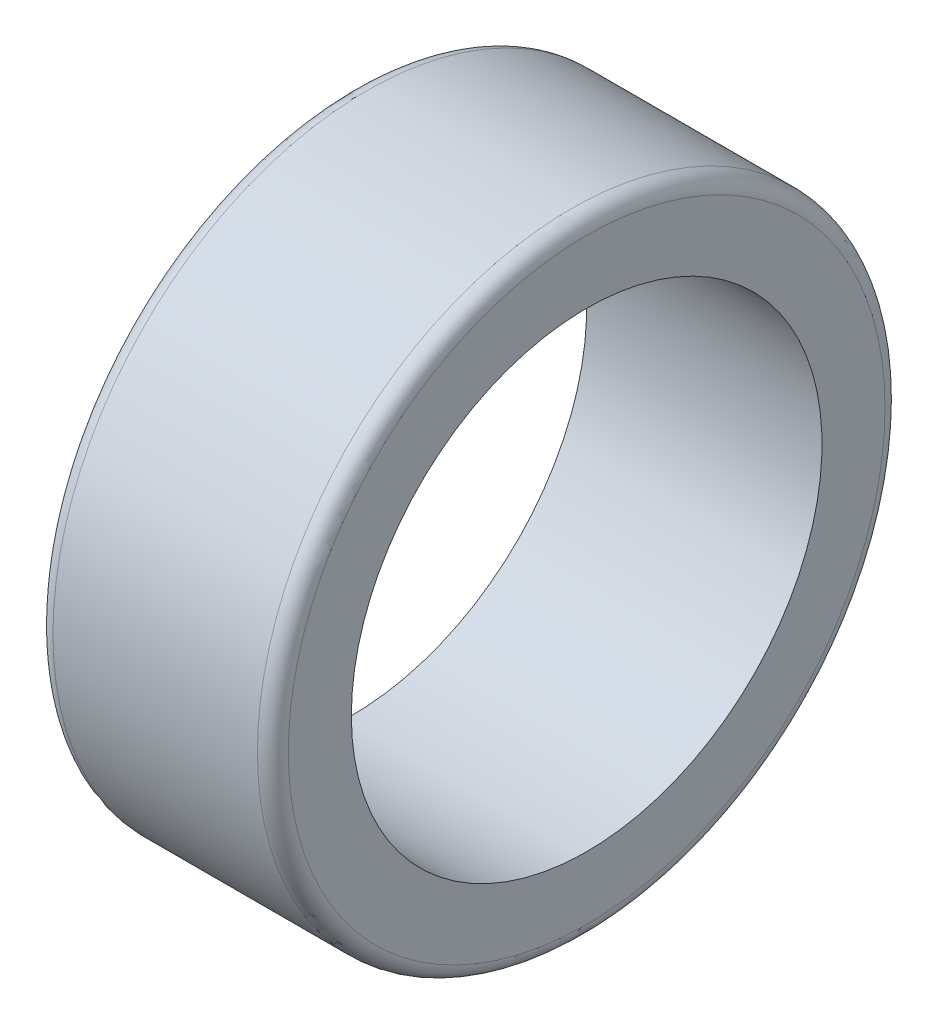
ISO-10303-21;
HEADER;
FILE_DESCRIPTION(('STEP AP214'),'2;1');
FILE_NAME('part.step','',(''),(''),'','','');
FILE_SCHEMA(('AUTOMOTIVE_DESIGN { 1 0 10303 214 1 1 1 1 }'));
ENDSEC;
DATA;
#1=APPLICATION_CONTEXT('core data for automotive mechanical design processes');
#2=APPLICATION_PROTOCOL_DEFINITION('international standard','automotive_design',2000,#1);
#3=PRODUCT_CONTEXT('',#1,'mechanical');
#4=PRODUCT('Part','Part','',(#3));
#5=PRODUCT_RELATED_PRODUCT_CATEGORY('part','',(#4));
#6=PRODUCT_DEFINITION_FORMATION('','',#4);
#7=PRODUCT_DEFINITION_CONTEXT('part definition',#1,'design');
#8=PRODUCT_DEFINITION('design','',#6,#7);
#9=PRODUCT_DEFINITION_SHAPE('','',#8);
#10=(LENGTH_UNIT() NAMED_UNIT(*) SI_UNIT(.MILLI.,.METRE.));
#11=(NAMED_UNIT(*) PLANE_ANGLE_UNIT() SI_UNIT($,.RADIAN.));
#12=(NAMED_UNIT(*) SI_UNIT($,.STERADIAN.) SOLID_ANGLE_UNIT());
#13=UNCERTAINTY_MEASURE_WITH_UNIT(LENGTH_MEASURE(1.E-05),#10,'distance_accuracy_value','');
#14=(GEOMETRIC_REPRESENTATION_CONTEXT(3) GLOBAL_UNCERTAINTY_ASSIGNED_CONTEXT((#13)) GLOBAL_UNIT_ASSIGNED_CONTEXT((#10,
#11,#12)) REPRESENTATION_CONTEXT('',''));
#15=CARTESIAN_POINT('',(0.,0.,0.));
#16=DIRECTION('',(0.,0.,1.));
#17=DIRECTION('',(1.,0.,0.));
#18=AXIS2_PLACEMENT_3D('',#15,#16,#17);
#19=CARTESIAN_POINT('',(38.1,0.,0.));
#20=DIRECTION('',(1.,0.,0.));
#21=DIRECTION('',(0.,0.,-1.));
#22=AXIS2_PLACEMENT_3D('',#19,#20,#21);
#23=PLANE('',#22);
#24=CARTESIAN_POINT('',(38.1,0.,0.));
#25=DIRECTION('',(1.,0.,0.));
#26=DIRECTION('',(0.,0.,-1.));
#27=AXIS2_PLACEMENT_3D('',#24,#25,#26);
#28=CIRCLE('',#27,96.6);
#29=CARTESIAN_POINT('',(38.1,0.,-96.6));
#30=VERTEX_POINT('',#29);
#31=EDGE_CURVE('E10',#30,#30,#28,.T.);
#32=ORIENTED_EDGE('',*,*,#31,.T.);
#33=EDGE_LOOP('',(#32));
#34=FACE_BOUND('',#33,.T.);
#35=CARTESIAN_POINT('',(38.1,0.,0.));
#36=DIRECTION('',(1.,0.,0.));
#37=DIRECTION('',(0.,0.,-1.));
#38=AXIS2_PLACEMENT_3D('',#35,#36,#37);
#39=CIRCLE('',#38,76.2);
#40=CARTESIAN_POINT('',(38.1,0.,76.2));
#41=VERTEX_POINT('',#40);
#42=EDGE_CURVE('E51',#41,#41,#39,.T.);
#43=ORIENTED_EDGE('',*,*,#42,.F.);
#44=EDGE_LOOP('',(#43));
#45=FACE_BOUND('',#44,.T.);
#46=ADVANCED_FACE('F31',(#34,#45),#23,.T.);
#47=CARTESIAN_POINT('',(-38.1,0.,0.));
#48=DIRECTION('',(1.,0.,0.));
#49=DIRECTION('',(0.,0.,-1.));
#50=AXIS2_PLACEMENT_3D('',#47,#48,#49);
#51=PLANE('',#50);
#52=CARTESIAN_POINT('',(-38.1,0.,0.));
#53=DIRECTION('',(1.,0.,0.));
#54=DIRECTION('',(0.,0.,-1.));
#55=AXIS2_PLACEMENT_3D('',#52,#53,#54);
#56=CIRCLE('',#55,96.6);
#57=CARTESIAN_POINT('',(-38.1,0.,-96.6));
#58=VERTEX_POINT('',#57);
#59=EDGE_CURVE('E38',#58,#58,#56,.F.);
#60=ORIENTED_EDGE('',*,*,#59,.T.);
#61=EDGE_LOOP('',(#60));
#62=FACE_BOUND('',#61,.T.);
#63=CARTESIAN_POINT('',(-38.1,0.,0.));
#64=DIRECTION('',(1.,0.,0.));
#65=DIRECTION('',(0.,0.,-1.));
#66=AXIS2_PLACEMENT_3D('',#63,#64,#65);
#67=CIRCLE('',#66,76.2);
#68=CARTESIAN_POINT('',(-38.1,0.,76.2));
#69=VERTEX_POINT('',#68);
#70=EDGE_CURVE('E52',#69,#69,#67,.T.);
#71=ORIENTED_EDGE('',*,*,#70,.T.);
#72=EDGE_LOOP('',(#71));
#73=FACE_BOUND('',#72,.T.);
#74=ADVANCED_FACE('F62',(#62,#73),#51,.F.);
#75=CARTESIAN_POINT('',(38.1,0.,0.));
#76=DIRECTION('',(-1.,0.,0.));
#77=DIRECTION('',(0.,0.,1.));
#78=AXIS2_PLACEMENT_3D('',#75,#76,#77);
#79=CYLINDRICAL_SURFACE('',#78,101.6);
#80=CARTESIAN_POINT('',(-33.1,0.,0.));
#81=DIRECTION('',(1.,0.,0.));
#82=DIRECTION('',(0.,0.,-1.));
#83=AXIS2_PLACEMENT_3D('',#80,#81,#82);
#84=CIRCLE('',#83,101.6);
#85=CARTESIAN_POINT('',(-33.1,0.,101.6));
#86=VERTEX_POINT('',#85);
#87=EDGE_CURVE('E42',#86,#86,#84,.T.);
#88=CARTESIAN_POINT('',(33.1,0.,0.));
#89=DIRECTION('',(1.,0.,0.));
#90=DIRECTION('',(0.,0.,-1.));
#91=AXIS2_PLACEMENT_3D('',#88,#89,#90);
#92=CIRCLE('',#91,101.6);
#93=CARTESIAN_POINT('',(33.1,0.,101.6));
#94=VERTEX_POINT('',#93);
#95=EDGE_CURVE('E46',#94,#94,#92,.F.);
#96=CARTESIAN_POINT('',(-33.1,0.,101.6));
#97=CARTESIAN_POINT('',(-32.4104166666667,0.,101.6));
#98=CARTESIAN_POINT('',(-31.7208333333333,0.,101.6));
#99=CARTESIAN_POINT('',(-30.3416666666667,0.,101.6));
#100=CARTESIAN_POINT('',(-29.6520833333334,0.,101.6));
#101=CARTESIAN_POINT('',(-28.2729166666667,0.,101.6));
#102=CARTESIAN_POINT('',(-27.5833333333334,0.,101.6));
#103=CARTESIAN_POINT('',(-26.2041666666667,0.,101.6));
#104=CARTESIAN_POINT('',(-25.5145833333334,0.,101.6));
#105=CARTESIAN_POINT('',(-24.1354166666667,0.,101.6));
#106=CARTESIAN_POINT('',(-23.4458333333334,0.,101.6));
#107=CARTESIAN_POINT('',(-22.0666666666667,0.,101.6));
#108=CARTESIAN_POINT('',(-21.3770833333334,0.,101.6));
#109=CARTESIAN_POINT('',(-19.9979166666667,0.,101.6));
#110=CARTESIAN_POINT('',(-19.3083333333334,0.,101.6));
#111=CARTESIAN_POINT('',(-17.9291666666667,0.,101.6));
#112=CARTESIAN_POINT('',(-17.2395833333334,0.,101.6));
#113=CARTESIAN_POINT('',(-15.8604166666667,0.,101.6));
#114=CARTESIAN_POINT('',(-15.1708333333334,0.,101.6));
#115=CARTESIAN_POINT('',(-13.7916666666667,0.,101.6));
#116=CARTESIAN_POINT('',(-13.1020833333334,0.,101.6));
#117=CARTESIAN_POINT('',(-11.7229166666667,0.,101.6));
#118=CARTESIAN_POINT('',(-11.0333333333334,0.,101.6));
#119=CARTESIAN_POINT('',(-9.65416666666669,0.,101.6));
#120=CARTESIAN_POINT('',(-8.96458333333335,0.,101.6));
#121=CARTESIAN_POINT('',(-7.58541666666668,0.,101.6));
#122=CARTESIAN_POINT('',(-6.89583333333335,0.,101.6));
#123=CARTESIAN_POINT('',(-5.51666666666668,0.,101.6));
#124=CARTESIAN_POINT('',(-4.82708333333335,0.,101.6));
#125=CARTESIAN_POINT('',(-3.44791666666668,0.,101.6));
#126=CARTESIAN_POINT('',(-2.75833333333335,0.,101.6));
#127=CARTESIAN_POINT('',(-1.37916666666668,0.,101.6));
#128=CARTESIAN_POINT('',(-0.689583333333347,0.,101.6));
#129=CARTESIAN_POINT('',(0.68958333333332,0.,101.6));
#130=CARTESIAN_POINT('',(1.37916666666665,0.,101.6));
#131=CARTESIAN_POINT('',(2.75833333333332,0.,101.6));
#132=CARTESIAN_POINT('',(3.44791666666665,0.,101.6));
#133=CARTESIAN_POINT('',(4.82708333333332,0.,101.6));
#134=CARTESIAN_POINT('',(5.51666666666666,0.,101.6));
#135=CARTESIAN_POINT('',(6.89583333333332,0.,101.6));
#136=CARTESIAN_POINT('',(7.58541666666665,0.,101.6));
#137=CARTESIAN_POINT('',(8.96458333333332,0.,101.6));
#138=CARTESIAN_POINT('',(9.65416666666665,0.,101.6));
#139=CARTESIAN_POINT('',(11.0333333333333,0.,101.6));
#140=CARTESIAN_POINT('',(11.7229166666667,0.,101.6));
#141=CARTESIAN_POINT('',(13.1020833333333,0.,101.6));
#142=CARTESIAN_POINT('',(13.7916666666667,0.,101.6));
#143=CARTESIAN_POINT('',(15.1708333333333,0.,101.6));
#144=CARTESIAN_POINT('',(15.8604166666667,0.,101.6));
#145=CARTESIAN_POINT('',(17.2395833333333,0.,101.6));
#146=CARTESIAN_POINT('',(17.9291666666667,0.,101.6));
#147=CARTESIAN_POINT('',(19.3083333333333,0.,101.6));
#148=CARTESIAN_POINT('',(19.9979166666667,0.,101.6));
#149=CARTESIAN_POINT('',(21.3770833333333,0.,101.6));
#150=CARTESIAN_POINT('',(22.0666666666667,0.,101.6));
#151=CARTESIAN_POINT('',(23.4458333333333,0.,101.6));
#152=CARTESIAN_POINT('',(24.1354166666667,0.,101.6));
#153=CARTESIAN_POINT('',(25.5145833333333,0.,101.6));
#154=CARTESIAN_POINT('',(26.2041666666667,0.,101.6));
#155=CARTESIAN_POINT('',(27.5833333333333,0.,101.6));
#156=CARTESIAN_POINT('',(28.2729166666667,0.,101.6));
#157=CARTESIAN_POINT('',(29.6520833333333,0.,101.6));
#158=CARTESIAN_POINT('',(30.3416666666667,0.,101.6));
#159=CARTESIAN_POINT('',(31.7208333333333,0.,101.6));
#160=CARTESIAN_POINT('',(32.4104166666667,0.,101.6));
#161=CARTESIAN_POINT('',(33.1,0.,101.6));
#162=B_SPLINE_CURVE_WITH_KNOTS('',3,(#96,#97,#98,#99,#100,#101,#102,#103,#104,#105,#106,#107,
#108,#109,#110,#111,#112,#113,#114,#115,#116,#117,#118,#119,#120,#121,#122,#123,#124,#125,#126,
#127,#128,#129,#130,#131,#132,#133,#134,#135,#136,#137,#138,#139,#140,#141,#142,#143,#144,#145,
#146,#147,#148,#149,#150,#151,#152,#153,#154,#155,#156,#157,#158,#159,#160,#161),.UNSPECIFIED.,
.F.,.F.,(4,2,2,2,2,2,2,2,2,2,2,2,2,2,2,2,2,2,2,2,2,2,2,2,2,2,2,2,2,2,2,2,4),(0.,
2.06875000000001,4.1375,6.20625,8.275,10.34375,12.4125,14.48125,16.55,18.61875,20.6875,22.75625,
24.825,26.89375,28.9625,31.03125,33.1,35.16875,37.2375,39.30625,41.375,43.44375,45.5125,
47.58125,49.65,51.71875,53.7875,55.85625,57.925,59.99375,62.0625,64.13125,66.2),.UNSPECIFIED.);
#163=EDGE_CURVE('BSEAM68',#86,#94,#162,.T.);
#164=ORIENTED_EDGE('',*,*,#87,.T.);
#165=ORIENTED_EDGE('',*,*,#95,.T.);
#166=ORIENTED_EDGE('',*,*,#163,.T.);
#167=ORIENTED_EDGE('',*,*,#163,.F.);
#168=EDGE_LOOP('',(#164,#166,#165,#167));
#169=FACE_BOUND('',#168,.T.);
#170=ADVANCED_FACE('F68',(#169),#79,.T.);
#171=CARTESIAN_POINT('',(38.1,0.,0.));
#172=DIRECTION('',(-1.,0.,0.));
#173=DIRECTION('',(0.,0.,1.));
#174=AXIS2_PLACEMENT_3D('',#171,#172,#173);
#175=CYLINDRICAL_SURFACE('',#174,76.2);
#176=CARTESIAN_POINT('',(38.1,0.,76.2));
#177=CARTESIAN_POINT('',(37.30625,0.,76.2));
#178=CARTESIAN_POINT('',(36.5125,0.,76.2));
#179=CARTESIAN_POINT('',(34.925,0.,76.2));
#180=CARTESIAN_POINT('',(34.13125,0.,76.2));
#181=CARTESIAN_POINT('',(32.54375,0.,76.2));
#182=CARTESIAN_POINT('',(31.75,0.,76.2));
#183=CARTESIAN_POINT('',(30.1625,0.,76.2));
#184=CARTESIAN_POINT('',(29.36875,0.,76.2));
#185=CARTESIAN_POINT('',(27.78125,0.,76.2));
#186=CARTESIAN_POINT('',(26.9875,0.,76.2));
#187=CARTESIAN_POINT('',(25.4,0.,76.2));
#188=CARTESIAN_POINT('',(24.60625,0.,76.2));
#189=CARTESIAN_POINT('',(23.01875,0.,76.2));
#190=CARTESIAN_POINT('',(22.225,0.,76.2));
#191=CARTESIAN_POINT('',(20.6375,0.,76.2));
#192=CARTESIAN_POINT('',(19.84375,0.,76.2));
#193=CARTESIAN_POINT('',(18.25625,0.,76.2));
#194=CARTESIAN_POINT('',(17.4625,0.,76.2));
#195=CARTESIAN_POINT('',(15.875,0.,76.2));
#196=CARTESIAN_POINT('',(15.08125,0.,76.2));
#197=CARTESIAN_POINT('',(13.49375,0.,76.2));
#198=CARTESIAN_POINT('',(12.7,0.,76.2));
#199=CARTESIAN_POINT('',(11.1125,0.,76.2));
#200=CARTESIAN_POINT('',(10.31875,0.,76.2));
#201=CARTESIAN_POINT('',(8.73124999999999,0.,76.2));
#202=CARTESIAN_POINT('',(7.93749999999999,0.,76.2));
#203=CARTESIAN_POINT('',(6.35,0.,76.2));
#204=CARTESIAN_POINT('',(5.55625,0.,76.2));
#205=CARTESIAN_POINT('',(3.96875,0.,76.2));
#206=CARTESIAN_POINT('',(3.175,0.,76.2));
#207=CARTESIAN_POINT('',(1.5875,0.,76.2));
#208=CARTESIAN_POINT('',(0.793750000000001,0.,76.2));
#209=CARTESIAN_POINT('',(-0.793750000000001,0.,76.2));
#210=CARTESIAN_POINT('',(-1.5875,0.,76.2));
#211=CARTESIAN_POINT('',(-3.175,0.,76.2));
#212=CARTESIAN_POINT('',(-3.96875,0.,76.2));
#213=CARTESIAN_POINT('',(-5.55625,0.,76.2));
#214=CARTESIAN_POINT('',(-6.35,0.,76.2));
#215=CARTESIAN_POINT('',(-7.93750000000001,0.,76.2));
#216=CARTESIAN_POINT('',(-8.73125,0.,76.2));
#217=CARTESIAN_POINT('',(-10.31875,0.,76.2));
#218=CARTESIAN_POINT('',(-11.1125,0.,76.2));
#219=CARTESIAN_POINT('',(-12.7,0.,76.2));
#220=CARTESIAN_POINT('',(-13.49375,0.,76.2));
#221=CARTESIAN_POINT('',(-15.08125,0.,76.2));
#222=CARTESIAN_POINT('',(-15.875,0.,76.2));
#223=CARTESIAN_POINT('',(-17.4625,0.,76.2));
#224=CARTESIAN_POINT('',(-18.25625,0.,76.2));
#225=CARTESIAN_POINT('',(-19.84375,0.,76.2));
#226=CARTESIAN_POINT('',(-20.6375,0.,76.2));
#227=CARTESIAN_POINT('',(-22.225,0.,76.2));
#228=CARTESIAN_POINT('',(-23.01875,0.,76.2));
#229=CARTESIAN_POINT('',(-24.60625,0.,76.2));
#230=CARTESIAN_POINT('',(-25.4,0.,76.2));
#231=CARTESIAN_POINT('',(-26.9875,0.,76.2));
#232=CARTESIAN_POINT('',(-27.78125,0.,76.2));
#233=CARTESIAN_POINT('',(-29.36875,0.,76.2));
#234=CARTESIAN_POINT('',(-30.1625,0.,76.2));
#235=CARTESIAN_POINT('',(-31.75,0.,76.2));
#236=CARTESIAN_POINT('',(-32.54375,0.,76.2));
#237=CARTESIAN_POINT('',(-34.13125,0.,76.2));
#238=CARTESIAN_POINT('',(-34.925,0.,76.2));
#239=CARTESIAN_POINT('',(-36.5125,0.,76.2));
#240=CARTESIAN_POINT('',(-37.30625,0.,76.2));
#241=CARTESIAN_POINT('',(-38.1,0.,76.2));
#242=B_SPLINE_CURVE_WITH_KNOTS('',3,(#176,#177,#178,#179,#180,#181,#182,#183,#184,#185,#186,
#187,#188,#189,#190,#191,#192,#193,#194,#195,#196,#197,#198,#199,#200,#201,#202,#203,#204,#205,
#206,#207,#208,#209,#210,#211,#212,#213,#214,#215,#216,#217,#218,#219,#220,#221,#222,#223,#224,
#225,#226,#227,#228,#229,#230,#231,#232,#233,#234,#235,#236,#237,#238,#239,#240,#241),
.UNSPECIFIED.,.F.,.F.,(4,2,2,2,2,2,2,2,2,2,2,2,2,2,2,2,2,2,2,2,2,2,2,2,2,2,2,2,2,2,2,2,4),(0.,
2.38125,4.7625,7.14375,9.52500000000001,11.90625,14.2875,16.66875,19.05,21.43125,23.8125,
26.19375,28.575,30.95625,33.3375,35.71875,38.1,40.48125,42.8625,45.24375,47.625,50.00625,
52.3875,54.76875,57.15,59.53125,61.9125,64.29375,66.675,69.05625,71.4375,73.81875,76.2),.UNSPECIFIED.);
#243=EDGE_CURVE('BSEAM58',#41,#69,#242,.T.);
#244=ORIENTED_EDGE('',*,*,#42,.T.);
#245=ORIENTED_EDGE('',*,*,#70,.F.);
#246=ORIENTED_EDGE('',*,*,#243,.T.);
#247=ORIENTED_EDGE('',*,*,#243,.F.);
#248=EDGE_LOOP('',(#244,#246,#245,#247));
#249=FACE_BOUND('',#248,.T.);
#250=ADVANCED_FACE('F58',(#249),#175,.F.);
#251=CARTESIAN_POINT('',(-33.1,0.,0.));
#252=DIRECTION('',(1.,0.,0.));
#253=DIRECTION('',(0.,0.,-1.));
#254=AXIS2_PLACEMENT_3D('',#251,#252,#253);
#255=TOROIDAL_SURFACE('',#254,96.6,5.);
#256=ORIENTED_EDGE('',*,*,#59,.F.);
#257=EDGE_LOOP('',(#256));
#258=FACE_BOUND('',#257,.T.);
#259=ORIENTED_EDGE('',*,*,#87,.F.);
#260=EDGE_LOOP('',(#259));
#261=FACE_BOUND('',#260,.T.);
#262=ADVANCED_FACE('F74',(#258,#261),#255,.T.);
#263=CARTESIAN_POINT('',(33.1,0.,0.));
#264=DIRECTION('',(1.,0.,0.));
#265=DIRECTION('',(0.,0.,-1.));
#266=AXIS2_PLACEMENT_3D('',#263,#264,#265);
#267=TOROIDAL_SURFACE('',#266,96.6,5.);
#268=ORIENTED_EDGE('',*,*,#95,.F.);
#269=EDGE_LOOP('',(#268));
#270=FACE_BOUND('',#269,.T.);
#271=ORIENTED_EDGE('',*,*,#31,.F.);
#272=EDGE_LOOP('',(#271));
#273=FACE_BOUND('',#272,.T.);
#274=ADVANCED_FACE('F33',(#270,#273),#267,.T.);
#275=CLOSED_SHELL('',(#46,#74,#170,#250,#262,#274));
#276=MANIFOLD_SOLID_BREP('B2',#275);
#277=ADVANCED_BREP_SHAPE_REPRESENTATION('',(#18,#276),#14);
#278=SHAPE_DEFINITION_REPRESENTATION(#9,#277);
ENDSEC;
END-ISO-10303-21;
